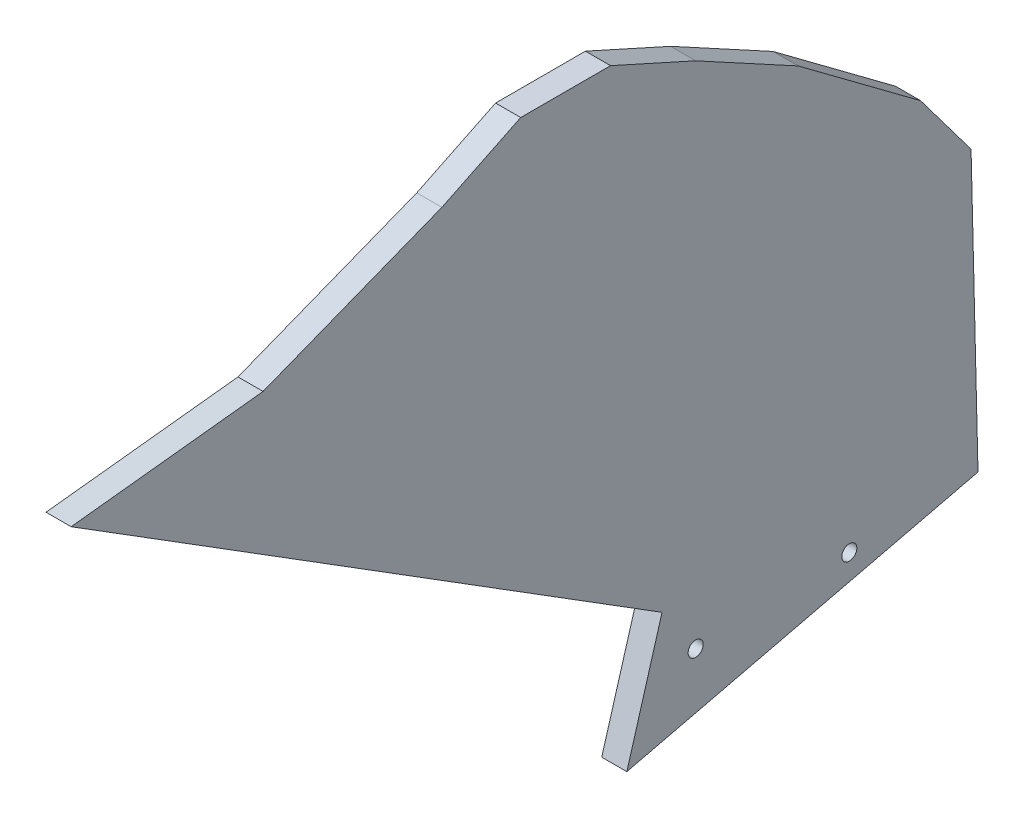
ISO-10303-21;
HEADER;
FILE_DESCRIPTION(('STEP AP214'),'2;1');
FILE_NAME('part.step','',(''),(''),'','','');
FILE_SCHEMA(('AUTOMOTIVE_DESIGN { 1 0 10303 214 1 1 1 1 }'));
ENDSEC;
DATA;
#1=APPLICATION_CONTEXT('core data for automotive mechanical design processes');
#2=APPLICATION_PROTOCOL_DEFINITION('international standard','automotive_design',2000,#1);
#3=PRODUCT_CONTEXT('',#1,'mechanical');
#4=PRODUCT('Part','Part','',(#3));
#5=PRODUCT_RELATED_PRODUCT_CATEGORY('part','',(#4));
#6=PRODUCT_DEFINITION_FORMATION('','',#4);
#7=PRODUCT_DEFINITION_CONTEXT('part definition',#1,'design');
#8=PRODUCT_DEFINITION('design','',#6,#7);
#9=PRODUCT_DEFINITION_SHAPE('','',#8);
#10=(LENGTH_UNIT() NAMED_UNIT(*) SI_UNIT(.MILLI.,.METRE.));
#11=(NAMED_UNIT(*) PLANE_ANGLE_UNIT() SI_UNIT($,.RADIAN.));
#12=(NAMED_UNIT(*) SI_UNIT($,.STERADIAN.) SOLID_ANGLE_UNIT());
#13=UNCERTAINTY_MEASURE_WITH_UNIT(LENGTH_MEASURE(1.E-05),#10,'distance_accuracy_value','');
#14=(GEOMETRIC_REPRESENTATION_CONTEXT(3) GLOBAL_UNCERTAINTY_ASSIGNED_CONTEXT((#13)) GLOBAL_UNIT_ASSIGNED_CONTEXT((#10,
#11,#12)) REPRESENTATION_CONTEXT('',''));
#15=CARTESIAN_POINT('',(0.,0.,0.));
#16=DIRECTION('',(0.,0.,1.));
#17=DIRECTION('',(1.,0.,0.));
#18=AXIS2_PLACEMENT_3D('',#15,#16,#17);
#19=CARTESIAN_POINT('',(2.,40.7290803426148,19.8362768334419));
#20=DIRECTION('',(0.,-0.89904284004147,-0.437860676208961));
#21=DIRECTION('',(0.,0.437860676208961,-0.89904284004147));
#22=AXIS2_PLACEMENT_3D('',#19,#20,#21);
#23=PLANE('',#22);
#24=DIRECTION('',(0.,-0.437860676208961,0.89904284004147));
#25=VECTOR('',#24,1.);
#26=CARTESIAN_POINT('',(0.,40.7290803426148,19.8362768334419));
#27=LINE('',#26,#25);
#28=CARTESIAN_POINT('',(0.,43.6026244763,13.9361368590086));
#29=VERTEX_POINT('',#28);
#30=CARTESIAN_POINT('',(0.,40.5466208821608,20.2109139735916));
#31=VERTEX_POINT('',#30);
#32=EDGE_CURVE('E165',#29,#31,#27,.T.);
#33=ORIENTED_EDGE('',*,*,#32,.T.);
#34=DIRECTION('',(-1.,0.,0.));
#35=VECTOR('',#34,1.);
#36=CARTESIAN_POINT('',(2.,40.5466208821608,20.2109139735916));
#37=LINE('',#36,#35);
#38=CARTESIAN_POINT('',(2.,40.5466208821608,20.2109139735916));
#39=VERTEX_POINT('',#38);
#40=EDGE_CURVE('E11',#39,#31,#37,.T.);
#41=ORIENTED_EDGE('',*,*,#40,.F.);
#42=DIRECTION('',(0.,-0.437860676208961,0.89904284004147));
#43=VECTOR('',#42,1.);
#44=CARTESIAN_POINT('',(2.,40.7290803426148,19.8362768334419));
#45=LINE('',#44,#43);
#46=CARTESIAN_POINT('',(2.,43.6026244763,13.9361368590086));
#47=VERTEX_POINT('',#46);
#48=EDGE_CURVE('E233',#47,#39,#45,.T.);
#49=ORIENTED_EDGE('',*,*,#48,.F.);
#50=DIRECTION('',(-1.,0.,0.));
#51=VECTOR('',#50,1.);
#52=CARTESIAN_POINT('',(2.,43.6026244763,13.9361368590086));
#53=LINE('',#52,#51);
#54=EDGE_CURVE('E155',#47,#29,#53,.T.);
#55=ORIENTED_EDGE('',*,*,#54,.T.);
#56=EDGE_LOOP('',(#33,#41,#49,#55));
#57=FACE_BOUND('',#56,.T.);
#58=ADVANCED_FACE('F37',(#57),#23,.F.);
#59=CARTESIAN_POINT('',(2.,42.0179442594643,16.453549397654));
#60=DIRECTION('',(0.,-0.931154427082369,-0.364625058004665));
#61=DIRECTION('',(0.,0.364625058004665,-0.931154427082369));
#62=AXIS2_PLACEMENT_3D('',#59,#60,#61);
#63=PLANE('',#62);
#64=DIRECTION('',(0.,-0.364625058004665,0.931154427082369));
#65=VECTOR('',#64,1.);
#66=CARTESIAN_POINT('',(0.,42.0179442594643,16.453549397654));
#67=LINE('',#66,#65);
#68=CARTESIAN_POINT('',(0.,34.9686521471734,34.455547379023));
#69=VERTEX_POINT('',#68);
#70=EDGE_CURVE('E168',#31,#69,#67,.T.);
#71=ORIENTED_EDGE('',*,*,#70,.T.);
#72=DIRECTION('',(-1.,0.,0.));
#73=VECTOR('',#72,1.);
#74=CARTESIAN_POINT('',(2.,34.9686521471734,34.455547379023));
#75=LINE('',#74,#73);
#76=CARTESIAN_POINT('',(2.,34.9686521471734,34.455547379023));
#77=VERTEX_POINT('',#76);
#78=EDGE_CURVE('E46',#77,#69,#75,.T.);
#79=ORIENTED_EDGE('',*,*,#78,.F.);
#80=DIRECTION('',(0.,-0.364625058004665,0.931154427082369));
#81=VECTOR('',#80,1.);
#82=CARTESIAN_POINT('',(2.,42.0179442594643,16.453549397654));
#83=LINE('',#82,#81);
#84=EDGE_CURVE('E109',#39,#77,#83,.T.);
#85=ORIENTED_EDGE('',*,*,#84,.F.);
#86=ORIENTED_EDGE('',*,*,#40,.T.);
#87=EDGE_LOOP('',(#71,#79,#85,#86));
#88=FACE_BOUND('',#87,.T.);
#89=ADVANCED_FACE('F215',(#88),#63,.F.);
#90=CARTESIAN_POINT('',(2.,38.3040182295069,4.22630211598408));
#91=DIRECTION('',(0.,0.993968031708693,0.10967019623009));
#92=DIRECTION('',(0.,-0.10967019623009,0.993968031708693));
#93=AXIS2_PLACEMENT_3D('',#90,#91,#92);
#94=PLANE('',#93);
#95=DIRECTION('',(0.,0.10967019623009,-0.993968031708693));
#96=VECTOR('',#95,1.);
#97=CARTESIAN_POINT('',(0.,38.3040182295069,4.22630211598408));
#98=LINE('',#97,#96);
#99=CARTESIAN_POINT('',(0.,33.2816381506845,49.7453712253941));
#100=VERTEX_POINT('',#99);
#101=EDGE_CURVE('E171',#100,#69,#98,.T.);
#102=ORIENTED_EDGE('',*,*,#101,.F.);
#103=DIRECTION('',(-1.,0.,0.));
#104=VECTOR('',#103,1.);
#105=CARTESIAN_POINT('',(2.,33.2816381506845,49.7453712253941));
#106=LINE('',#105,#104);
#107=CARTESIAN_POINT('',(2.,33.2816381506845,49.7453712253941));
#108=VERTEX_POINT('',#107);
#109=EDGE_CURVE('E208',#108,#100,#106,.T.);
#110=ORIENTED_EDGE('',*,*,#109,.F.);
#111=DIRECTION('',(0.,0.10967019623009,-0.993968031708693));
#112=VECTOR('',#111,1.);
#113=CARTESIAN_POINT('',(2.,38.3040182295069,4.22630211598408));
#114=LINE('',#113,#112);
#115=EDGE_CURVE('E214',#108,#77,#114,.T.);
#116=ORIENTED_EDGE('',*,*,#115,.T.);
#117=ORIENTED_EDGE('',*,*,#78,.T.);
#118=EDGE_LOOP('',(#102,#110,#116,#117));
#119=FACE_BOUND('',#118,.T.);
#120=ADVANCED_FACE('F212',(#119),#94,.T.);
#121=CARTESIAN_POINT('',(2.,1.55787991288505,-0.974408910826404));
#122=DIRECTION('',(0.,-0.847818734661311,0.530286142716641));
#123=DIRECTION('',(0.,-0.530286142716641,-0.847818734661311));
#124=AXIS2_PLACEMENT_3D('',#121,#122,#123);
#125=PLANE('',#124);
#126=DIRECTION('',(0.,0.530286142716641,0.847818734661311));
#127=VECTOR('',#126,1.);
#128=CARTESIAN_POINT('',(0.,1.55787991288505,-0.974408910826404));
#129=LINE('',#128,#127);
#130=CARTESIAN_POINT('',(0.,3.84259319763972,2.67837883923866));
#131=VERTEX_POINT('',#130);
#132=EDGE_CURVE('E174',#131,#100,#129,.T.);
#133=ORIENTED_EDGE('',*,*,#132,.F.);
#134=DIRECTION('',(-1.,0.,0.));
#135=VECTOR('',#134,1.);
#136=CARTESIAN_POINT('',(2.,3.84259319763972,2.67837883923866));
#137=LINE('',#136,#135);
#138=CARTESIAN_POINT('',(2.,3.84259319763972,2.67837883923866));
#139=VERTEX_POINT('',#138);
#140=EDGE_CURVE('E206',#139,#131,#137,.T.);
#141=ORIENTED_EDGE('',*,*,#140,.F.);
#142=DIRECTION('',(0.,0.530286142716641,0.847818734661311));
#143=VECTOR('',#142,1.);
#144=CARTESIAN_POINT('',(2.,1.55787991288505,-0.974408910826404));
#145=LINE('',#144,#143);
#146=EDGE_CURVE('E227',#139,#108,#145,.T.);
#147=ORIENTED_EDGE('',*,*,#146,.T.);
#148=ORIENTED_EDGE('',*,*,#109,.T.);
#149=EDGE_LOOP('',(#133,#141,#147,#148));
#150=FACE_BOUND('',#149,.T.);
#151=ADVANCED_FACE('F224',(#150),#125,.T.);
#152=CARTESIAN_POINT('',(2.,1.02476059068593,3.50275871788005));
#153=DIRECTION('',(0.,0.280788438742335,0.959769687304534));
#154=DIRECTION('',(0.,-0.959769687304534,0.280788438742335));
#155=AXIS2_PLACEMENT_3D('',#152,#153,#154);
#156=PLANE('',#155);
#157=DIRECTION('',(0.,0.959769687304534,-0.280788438742335));
#158=VECTOR('',#157,1.);
#159=CARTESIAN_POINT('',(0.,1.02476059068593,3.50275871788005));
#160=LINE('',#159,#158);
#161=CARTESIAN_POINT('',(0.,-5.74621259531446,5.48366206876907));
#162=VERTEX_POINT('',#161);
#163=EDGE_CURVE('E177',#162,#131,#160,.T.);
#164=ORIENTED_EDGE('',*,*,#163,.F.);
#165=DIRECTION('',(-1.,0.,0.));
#166=VECTOR('',#165,1.);
#167=CARTESIAN_POINT('',(2.,-5.74621259531446,5.48366206876907));
#168=LINE('',#167,#166);
#169=CARTESIAN_POINT('',(2.,-5.74621259531446,5.48366206876907));
#170=VERTEX_POINT('',#169);
#171=EDGE_CURVE('E204',#170,#162,#168,.T.);
#172=ORIENTED_EDGE('',*,*,#171,.F.);
#173=DIRECTION('',(0.,0.959769687304534,-0.280788438742335));
#174=VECTOR('',#173,1.);
#175=CARTESIAN_POINT('',(2.,1.02476059068593,3.50275871788005));
#176=LINE('',#175,#174);
#177=EDGE_CURVE('E231',#170,#139,#176,.T.);
#178=ORIENTED_EDGE('',*,*,#177,.T.);
#179=ORIENTED_EDGE('',*,*,#140,.T.);
#180=EDGE_LOOP('',(#164,#172,#178,#179));
#181=FACE_BOUND('',#180,.T.);
#182=ADVANCED_FACE('F364',(#181),#156,.T.);
#183=CARTESIAN_POINT('',(2.,-4.19582842403455,-1.00286967396902));
#184=DIRECTION('',(0.,0.972604085211016,0.232467833109965));
#185=DIRECTION('',(0.,-0.232467833109965,0.972604085211016));
#186=AXIS2_PLACEMENT_3D('',#183,#184,#185);
#187=PLANE('',#186);
#188=DIRECTION('',(0.,0.232467833109965,-0.972604085211016));
#189=VECTOR('',#188,1.);
#190=CARTESIAN_POINT('',(0.,-4.19582842403455,-1.00286967396902));
#191=LINE('',#190,#189);
#192=CARTESIAN_POINT('',(0.,0.939195285215142,-22.4868959603464));
#193=VERTEX_POINT('',#192);
#194=EDGE_CURVE('E180',#162,#193,#191,.T.);
#195=ORIENTED_EDGE('',*,*,#194,.T.);
#196=DIRECTION('',(-1.,0.,0.));
#197=VECTOR('',#196,1.);
#198=CARTESIAN_POINT('',(2.,0.939195285215142,-22.4868959603464));
#199=LINE('',#198,#197);
#200=CARTESIAN_POINT('',(2.,0.939195285215142,-22.4868959603464));
#201=VERTEX_POINT('',#200);
#202=EDGE_CURVE('E202',#201,#193,#199,.T.);
#203=ORIENTED_EDGE('',*,*,#202,.F.);
#204=DIRECTION('',(0.,0.232467833109965,-0.972604085211016));
#205=VECTOR('',#204,1.);
#206=CARTESIAN_POINT('',(2.,-4.19582842403455,-1.00286967396902));
#207=LINE('',#206,#205);
#208=EDGE_CURVE('E238',#170,#201,#207,.T.);
#209=ORIENTED_EDGE('',*,*,#208,.F.);
#210=ORIENTED_EDGE('',*,*,#171,.T.);
#211=EDGE_LOOP('',(#195,#203,#209,#210));
#212=FACE_BOUND('',#211,.T.);
#213=ADVANCED_FACE('F356',(#212),#187,.F.);
#214=CARTESIAN_POINT('',(2.,0.551192368747631,-22.4964025579483));
#215=DIRECTION('',(0.,0.0244940050685,-0.999699976850907));
#216=DIRECTION('',(0.,0.999699976850907,0.0244940050685));
#217=AXIS2_PLACEMENT_3D('',#214,#215,#216);
#218=PLANE('',#217);
#219=DIRECTION('',(0.,-0.999699976850907,-0.0244940050685));
#220=VECTOR('',#219,1.);
#221=CARTESIAN_POINT('',(0.,0.551192368747631,-22.4964025579483));
#222=LINE('',#221,#220);
#223=CARTESIAN_POINT('',(0.,23.4858788377671,-21.9344716390479));
#224=VERTEX_POINT('',#223);
#225=EDGE_CURVE('E183',#224,#193,#222,.T.);
#226=ORIENTED_EDGE('',*,*,#225,.F.);
#227=DIRECTION('',(-1.,0.,0.));
#228=VECTOR('',#227,1.);
#229=CARTESIAN_POINT('',(2.,23.4858788377671,-21.9344716390479));
#230=LINE('',#229,#228);
#231=CARTESIAN_POINT('',(2.,23.4858788377671,-21.9344716390479));
#232=VERTEX_POINT('',#231);
#233=EDGE_CURVE('E200',#232,#224,#230,.T.);
#234=ORIENTED_EDGE('',*,*,#233,.F.);
#235=DIRECTION('',(0.,-0.999699976850907,-0.0244940050685));
#236=VECTOR('',#235,1.);
#237=CARTESIAN_POINT('',(2.,0.551192368747631,-22.4964025579483));
#238=LINE('',#237,#236);
#239=EDGE_CURVE('E240',#232,#201,#238,.T.);
#240=ORIENTED_EDGE('',*,*,#239,.T.);
#241=ORIENTED_EDGE('',*,*,#202,.T.);
#242=EDGE_LOOP('',(#226,#234,#240,#241));
#243=FACE_BOUND('',#242,.T.);
#244=ADVANCED_FACE('F253',(#243),#218,.T.);
#245=CARTESIAN_POINT('',(2.,18.9997518362162,-25.3030497572208));
#246=DIRECTION('',(0.,0.600454272646651,-0.799659093902134));
#247=DIRECTION('',(0.,0.799659093902134,0.600454272646651));
#248=AXIS2_PLACEMENT_3D('',#245,#246,#247);
#249=PLANE('',#248);
#250=DIRECTION('',(0.,-0.799659093902134,-0.600454272646651));
#251=VECTOR('',#250,1.);
#252=CARTESIAN_POINT('',(0.,18.9997518362162,-25.3030497572208));
#253=LINE('',#252,#251);
#254=CARTESIAN_POINT('',(0.,28.8392405112213,-17.9146975698721));
#255=VERTEX_POINT('',#254);
#256=EDGE_CURVE('E186',#255,#224,#253,.T.);
#257=ORIENTED_EDGE('',*,*,#256,.F.);
#258=DIRECTION('',(-1.,0.,0.));
#259=VECTOR('',#258,1.);
#260=CARTESIAN_POINT('',(2.,28.8392405112213,-17.9146975698721));
#261=LINE('',#260,#259);
#262=CARTESIAN_POINT('',(2.,28.8392405112213,-17.9146975698721));
#263=VERTEX_POINT('',#262);
#264=EDGE_CURVE('E198',#263,#255,#261,.T.);
#265=ORIENTED_EDGE('',*,*,#264,.F.);
#266=DIRECTION('',(0.,-0.799659093902134,-0.600454272646651));
#267=VECTOR('',#266,1.);
#268=CARTESIAN_POINT('',(2.,18.9997518362162,-25.3030497572208));
#269=LINE('',#268,#267);
#270=EDGE_CURVE('E243',#263,#232,#269,.T.);
#271=ORIENTED_EDGE('',*,*,#270,.T.);
#272=ORIENTED_EDGE('',*,*,#233,.T.);
#273=EDGE_LOOP('',(#257,#265,#271,#272));
#274=FACE_BOUND('',#273,.T.);
#275=ADVANCED_FACE('F247',(#274),#249,.T.);
#276=CARTESIAN_POINT('',(2.,27.117585480704,-20.2232808242007));
#277=DIRECTION('',(0.,-0.801627521320339,0.597823817743831));
#278=DIRECTION('',(0.,-0.597823817743831,-0.801627521320339));
#279=AXIS2_PLACEMENT_3D('',#276,#277,#278);
#280=PLANE('',#279);
#281=DIRECTION('',(0.,0.597823817743831,0.801627521320339));
#282=VECTOR('',#281,1.);
#283=CARTESIAN_POINT('',(0.,27.117585480704,-20.2232808242007));
#284=LINE('',#283,#282);
#285=CARTESIAN_POINT('',(0.,36.1151175251251,-8.1584063633772));
#286=VERTEX_POINT('',#285);
#287=EDGE_CURVE('E189',#255,#286,#284,.T.);
#288=ORIENTED_EDGE('',*,*,#287,.T.);
#289=DIRECTION('',(-1.,0.,0.));
#290=VECTOR('',#289,1.);
#291=CARTESIAN_POINT('',(2.,36.1151175251251,-8.1584063633772));
#292=LINE('',#291,#290);
#293=CARTESIAN_POINT('',(2.,36.1151175251251,-8.1584063633772));
#294=VERTEX_POINT('',#293);
#295=EDGE_CURVE('E150',#294,#286,#292,.T.);
#296=ORIENTED_EDGE('',*,*,#295,.F.);
#297=DIRECTION('',(0.,0.597823817743831,0.801627521320339));
#298=VECTOR('',#297,1.);
#299=CARTESIAN_POINT('',(2.,27.117585480704,-20.2232808242007));
#300=LINE('',#299,#298);
#301=EDGE_CURVE('E141',#263,#294,#300,.T.);
#302=ORIENTED_EDGE('',*,*,#301,.F.);
#303=ORIENTED_EDGE('',*,*,#264,.T.);
#304=EDGE_LOOP('',(#288,#296,#302,#303));
#305=FACE_BOUND('',#304,.T.);
#306=ADVANCED_FACE('F256',(#305),#280,.F.);
#307=CARTESIAN_POINT('',(2.,31.3089907925755,-17.0064950951113));
#308=DIRECTION('',(0.,-0.878733536255723,0.477312656714141));
#309=DIRECTION('',(0.,-0.477312656714141,-0.878733536255723));
#310=AXIS2_PLACEMENT_3D('',#307,#308,#309);
#311=PLANE('',#310);
#312=DIRECTION('',(0.,0.477312656714141,0.878733536255723));
#313=VECTOR('',#312,1.);
#314=CARTESIAN_POINT('',(0.,31.3089907925755,-17.0064950951113));
#315=LINE('',#314,#313);
#316=CARTESIAN_POINT('',(0.,40.5466208821608,0.));
#317=VERTEX_POINT('',#316);
#318=EDGE_CURVE('E149',#286,#317,#315,.T.);
#319=ORIENTED_EDGE('',*,*,#318,.T.);
#320=DIRECTION('',(-1.,0.,0.));
#321=VECTOR('',#320,1.);
#322=CARTESIAN_POINT('',(2.,40.5466208821608,0.));
#323=LINE('',#322,#321);
#324=CARTESIAN_POINT('',(2.,40.5466208821608,0.));
#325=VERTEX_POINT('',#324);
#326=EDGE_CURVE('E146',#325,#317,#323,.T.);
#327=ORIENTED_EDGE('',*,*,#326,.F.);
#328=DIRECTION('',(0.,0.477312656714141,0.878733536255723));
#329=VECTOR('',#328,1.);
#330=CARTESIAN_POINT('',(2.,31.3089907925755,-17.0064950951113));
#331=LINE('',#330,#329);
#332=EDGE_CURVE('E134',#294,#325,#331,.T.);
#333=ORIENTED_EDGE('',*,*,#332,.F.);
#334=ORIENTED_EDGE('',*,*,#295,.T.);
#335=EDGE_LOOP('',(#319,#327,#333,#334));
#336=FACE_BOUND('',#335,.T.);
#337=ADVANCED_FACE('F147',(#336),#311,.F.);
#338=CARTESIAN_POINT('',(2.,33.7015093331962,-15.1885019259373));
#339=DIRECTION('',(0.,-0.911690317575529,0.410878041320087));
#340=DIRECTION('',(0.,-0.410878041320087,-0.911690317575529));
#341=AXIS2_PLACEMENT_3D('',#338,#339,#340);
#342=PLANE('',#341);
#343=DIRECTION('',(0.,0.410878041320087,0.911690317575529));
#344=VECTOR('',#343,1.);
#345=CARTESIAN_POINT('',(0.,33.7015093331962,-15.1885019259373));
#346=LINE('',#345,#344);
#347=CARTESIAN_POINT('',(0.,43.6026244763,6.78091454656797));
#348=VERTEX_POINT('',#347);
#349=EDGE_CURVE('E95',#317,#348,#346,.T.);
#350=ORIENTED_EDGE('',*,*,#349,.T.);
#351=DIRECTION('',(-1.,0.,0.));
#352=VECTOR('',#351,1.);
#353=CARTESIAN_POINT('',(2.,43.6026244763,6.78091454656797));
#354=LINE('',#353,#352);
#355=CARTESIAN_POINT('',(2.,43.6026244763,6.78091454656797));
#356=VERTEX_POINT('',#355);
#357=EDGE_CURVE('E151',#356,#348,#354,.T.);
#358=ORIENTED_EDGE('',*,*,#357,.F.);
#359=DIRECTION('',(0.,0.410878041320087,0.911690317575529));
#360=VECTOR('',#359,1.);
#361=CARTESIAN_POINT('',(2.,33.7015093331962,-15.1885019259373));
#362=LINE('',#361,#360);
#363=EDGE_CURVE('E138',#325,#356,#362,.T.);
#364=ORIENTED_EDGE('',*,*,#363,.F.);
#365=ORIENTED_EDGE('',*,*,#326,.T.);
#366=EDGE_LOOP('',(#350,#358,#364,#365));
#367=FACE_BOUND('',#366,.T.);
#368=ADVANCED_FACE('F153',(#367),#342,.F.);
#369=CARTESIAN_POINT('',(2.,0.,0.));
#370=DIRECTION('',(-1.,0.,0.));
#371=DIRECTION('',(0.,0.,1.));
#372=AXIS2_PLACEMENT_3D('',#369,#370,#371);
#373=CYLINDRICAL_SURFACE('',#372,0.600000000000006);
#374=CARTESIAN_POINT('',(2.,0.,0.));
#375=DIRECTION('',(1.,0.,0.));
#376=DIRECTION('',(0.,0.,-1.));
#377=AXIS2_PLACEMENT_3D('',#374,#375,#376);
#378=CIRCLE('',#377,0.600000000000006);
#379=CARTESIAN_POINT('',(2.,0.,-0.600000000000006));
#380=VERTEX_POINT('',#379);
#381=EDGE_CURVE('E286',#380,#380,#378,.T.);
#382=ORIENTED_EDGE('',*,*,#381,.T.);
#383=EDGE_LOOP('',(#382));
#384=FACE_BOUND('',#383,.T.);
#385=CARTESIAN_POINT('',(0.,0.,0.));
#386=DIRECTION('',(1.,0.,0.));
#387=DIRECTION('',(0.,0.,-1.));
#388=AXIS2_PLACEMENT_3D('',#385,#386,#387);
#389=CIRCLE('',#388,0.600000000000006);
#390=CARTESIAN_POINT('',(0.,0.,-0.600000000000006));
#391=VERTEX_POINT('',#390);
#392=EDGE_CURVE('E162',#391,#391,#389,.T.);
#393=ORIENTED_EDGE('',*,*,#392,.F.);
#394=EDGE_LOOP('',(#393));
#395=FACE_BOUND('',#394,.T.);
#396=ADVANCED_FACE('F273',(#384,#395),#373,.F.);
#397=CARTESIAN_POINT('',(2.,0.518510559486578,-12.2371111903934));
#398=DIRECTION('',(-1.,0.,0.));
#399=DIRECTION('',(0.,0.,1.));
#400=AXIS2_PLACEMENT_3D('',#397,#398,#399);
#401=CYLINDRICAL_SURFACE('',#400,0.599999999999993);
#402=CARTESIAN_POINT('',(2.,0.518510559486578,-12.2371111903934));
#403=DIRECTION('',(1.,0.,0.));
#404=DIRECTION('',(0.,0.,-1.));
#405=AXIS2_PLACEMENT_3D('',#402,#403,#404);
#406=CIRCLE('',#405,0.599999999999993);
#407=CARTESIAN_POINT('',(2.,0.518510559486578,-12.8371111903934));
#408=VERTEX_POINT('',#407);
#409=EDGE_CURVE('E194',#408,#408,#406,.T.);
#410=ORIENTED_EDGE('',*,*,#409,.T.);
#411=EDGE_LOOP('',(#410));
#412=FACE_BOUND('',#411,.T.);
#413=CARTESIAN_POINT('',(0.,0.518510559486578,-12.2371111903934));
#414=DIRECTION('',(1.,0.,0.));
#415=DIRECTION('',(0.,0.,-1.));
#416=AXIS2_PLACEMENT_3D('',#413,#414,#415);
#417=CIRCLE('',#416,0.599999999999993);
#418=CARTESIAN_POINT('',(0.,0.518510559486578,-12.8371111903934));
#419=VERTEX_POINT('',#418);
#420=EDGE_CURVE('E159',#419,#419,#417,.T.);
#421=ORIENTED_EDGE('',*,*,#420,.F.);
#422=EDGE_LOOP('',(#421));
#423=FACE_BOUND('',#422,.T.);
#424=ADVANCED_FACE('F39',(#412,#423),#401,.F.);
#425=CARTESIAN_POINT('',(2.,43.6026244763,0.));
#426=DIRECTION('',(0.,-1.,0.));
#427=DIRECTION('',(0.,0.,-1.));
#428=AXIS2_PLACEMENT_3D('',#425,#426,#427);
#429=PLANE('',#428);
#430=DIRECTION('',(0.,0.,1.));
#431=VECTOR('',#430,1.);
#432=CARTESIAN_POINT('',(0.,43.6026244763,0.));
#433=LINE('',#432,#431);
#434=EDGE_CURVE('E101',#348,#29,#433,.T.);
#435=ORIENTED_EDGE('',*,*,#434,.T.);
#436=ORIENTED_EDGE('',*,*,#54,.F.);
#437=DIRECTION('',(0.,0.,1.));
#438=VECTOR('',#437,1.);
#439=CARTESIAN_POINT('',(2.,43.6026244763,0.));
#440=LINE('',#439,#438);
#441=EDGE_CURVE('E54',#356,#47,#440,.T.);
#442=ORIENTED_EDGE('',*,*,#441,.F.);
#443=ORIENTED_EDGE('',*,*,#357,.T.);
#444=EDGE_LOOP('',(#435,#436,#442,#443));
#445=FACE_BOUND('',#444,.T.);
#446=ADVANCED_FACE('F280',(#445),#429,.F.);
#447=CARTESIAN_POINT('',(2.,0.,0.));
#448=DIRECTION('',(1.,0.,0.));
#449=DIRECTION('',(0.,0.,-1.));
#450=AXIS2_PLACEMENT_3D('',#447,#448,#449);
#451=PLANE('',#450);
#452=ORIENTED_EDGE('',*,*,#409,.F.);
#453=EDGE_LOOP('',(#452));
#454=FACE_BOUND('',#453,.T.);
#455=ORIENTED_EDGE('',*,*,#381,.F.);
#456=EDGE_LOOP('',(#455));
#457=FACE_BOUND('',#456,.T.);
#458=ORIENTED_EDGE('',*,*,#48,.T.);
#459=ORIENTED_EDGE('',*,*,#84,.T.);
#460=ORIENTED_EDGE('',*,*,#115,.F.);
#461=ORIENTED_EDGE('',*,*,#146,.F.);
#462=ORIENTED_EDGE('',*,*,#177,.F.);
#463=ORIENTED_EDGE('',*,*,#208,.T.);
#464=ORIENTED_EDGE('',*,*,#239,.F.);
#465=ORIENTED_EDGE('',*,*,#270,.F.);
#466=ORIENTED_EDGE('',*,*,#301,.T.);
#467=ORIENTED_EDGE('',*,*,#332,.T.);
#468=ORIENTED_EDGE('',*,*,#363,.T.);
#469=ORIENTED_EDGE('',*,*,#441,.T.);
#470=EDGE_LOOP('',(#458,#459,#460,#461,#462,#463,#464,#465,#466,#467,#468,#469));
#471=FACE_BOUND('',#470,.T.);
#472=ADVANCED_FACE('F136',(#454,#457,#471),#451,.T.);
#473=CARTESIAN_POINT('',(0.,0.,0.));
#474=DIRECTION('',(1.,0.,0.));
#475=DIRECTION('',(0.,0.,-1.));
#476=AXIS2_PLACEMENT_3D('',#473,#474,#475);
#477=PLANE('',#476);
#478=ORIENTED_EDGE('',*,*,#420,.T.);
#479=EDGE_LOOP('',(#478));
#480=FACE_BOUND('',#479,.T.);
#481=ORIENTED_EDGE('',*,*,#392,.T.);
#482=EDGE_LOOP('',(#481));
#483=FACE_BOUND('',#482,.T.);
#484=ORIENTED_EDGE('',*,*,#32,.F.);
#485=ORIENTED_EDGE('',*,*,#434,.F.);
#486=ORIENTED_EDGE('',*,*,#349,.F.);
#487=ORIENTED_EDGE('',*,*,#318,.F.);
#488=ORIENTED_EDGE('',*,*,#287,.F.);
#489=ORIENTED_EDGE('',*,*,#256,.T.);
#490=ORIENTED_EDGE('',*,*,#225,.T.);
#491=ORIENTED_EDGE('',*,*,#194,.F.);
#492=ORIENTED_EDGE('',*,*,#163,.T.);
#493=ORIENTED_EDGE('',*,*,#132,.T.);
#494=ORIENTED_EDGE('',*,*,#101,.T.);
#495=ORIENTED_EDGE('',*,*,#70,.F.);
#496=EDGE_LOOP('',(#484,#485,#486,#487,#488,#489,#490,#491,#492,#493,#494,#495));
#497=FACE_BOUND('',#496,.T.);
#498=ADVANCED_FACE('F219',(#480,#483,#497),#477,.F.);
#499=CLOSED_SHELL('',(#58,#89,#120,#151,#182,#213,#244,#275,#306,#337,#368,#396,#424,#446,#472,#498));
#500=MANIFOLD_SOLID_BREP('B2',#499);
#501=ADVANCED_BREP_SHAPE_REPRESENTATION('',(#18,#500),#14);
#502=SHAPE_DEFINITION_REPRESENTATION(#9,#501);
ENDSEC;
END-ISO-10303-21;
